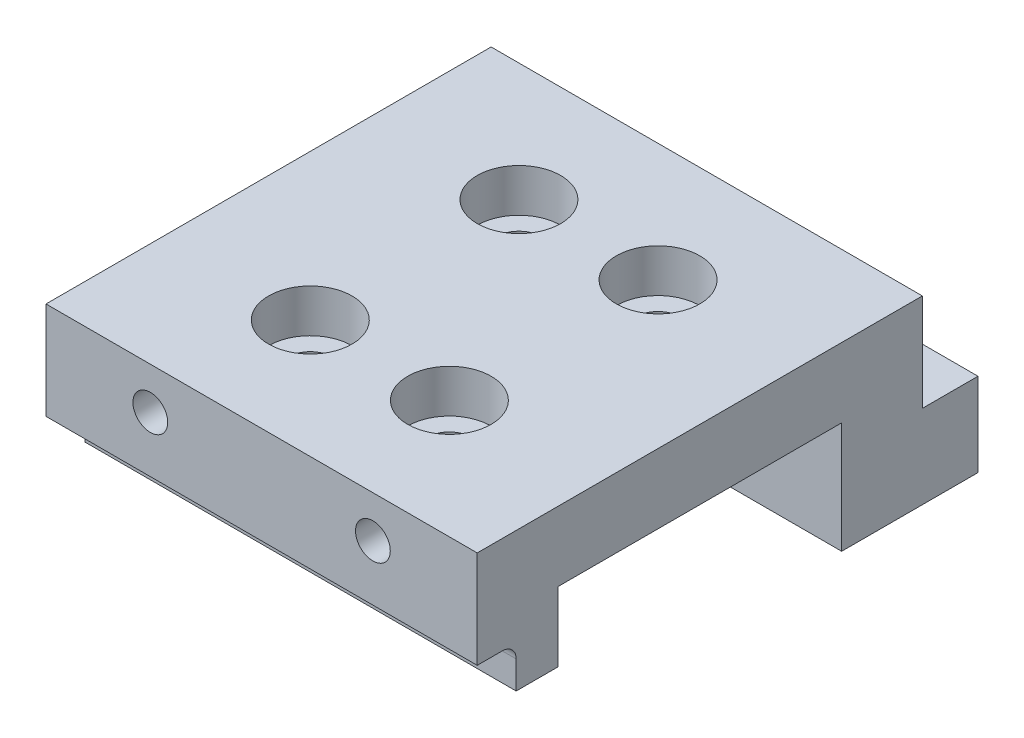
ISO-10303-21;
HEADER;
FILE_DESCRIPTION(('STEP AP214'),'2;1');
FILE_NAME('part.step','',(''),(''),'','','');
FILE_SCHEMA(('AUTOMOTIVE_DESIGN { 1 0 10303 214 1 1 1 1 }'));
ENDSEC;
DATA;
#1=APPLICATION_CONTEXT('core data for automotive mechanical design processes');
#2=APPLICATION_PROTOCOL_DEFINITION('international standard','automotive_design',2000,#1);
#3=PRODUCT_CONTEXT('',#1,'mechanical');
#4=PRODUCT('Part','Part','',(#3));
#5=PRODUCT_RELATED_PRODUCT_CATEGORY('part','',(#4));
#6=PRODUCT_DEFINITION_FORMATION('','',#4);
#7=PRODUCT_DEFINITION_CONTEXT('part definition',#1,'design');
#8=PRODUCT_DEFINITION('design','',#6,#7);
#9=PRODUCT_DEFINITION_SHAPE('','',#8);
#10=(LENGTH_UNIT() NAMED_UNIT(*) SI_UNIT(.MILLI.,.METRE.));
#11=(NAMED_UNIT(*) PLANE_ANGLE_UNIT() SI_UNIT($,.RADIAN.));
#12=(NAMED_UNIT(*) SI_UNIT($,.STERADIAN.) SOLID_ANGLE_UNIT());
#13=UNCERTAINTY_MEASURE_WITH_UNIT(LENGTH_MEASURE(1.E-05),#10,'distance_accuracy_value','');
#14=(GEOMETRIC_REPRESENTATION_CONTEXT(3) GLOBAL_UNCERTAINTY_ASSIGNED_CONTEXT((#13)) GLOBAL_UNIT_ASSIGNED_CONTEXT((#10,
#11,#12)) REPRESENTATION_CONTEXT('',''));
#15=CARTESIAN_POINT('',(0.,0.,0.));
#16=DIRECTION('',(0.,0.,1.));
#17=DIRECTION('',(1.,0.,0.));
#18=AXIS2_PLACEMENT_3D('',#15,#16,#17);
#19=CARTESIAN_POINT('',(0.,5.,0.));
#20=DIRECTION('',(0.,-1.,0.));
#21=DIRECTION('',(0.,0.,-1.));
#22=AXIS2_PLACEMENT_3D('',#19,#20,#21);
#23=PLANE('',#22);
#24=CARTESIAN_POINT('',(10.5,5.,-27.5));
#25=DIRECTION('',(0.,1.,0.));
#26=DIRECTION('',(0.,0.,1.));
#27=AXIS2_PLACEMENT_3D('',#24,#25,#26);
#28=CIRCLE('',#27,3.);
#29=CARTESIAN_POINT('',(10.5,5.,-24.5));
#30=VERTEX_POINT('',#29);
#31=EDGE_CURVE('E240',#30,#30,#28,.T.);
#32=ORIENTED_EDGE('',*,*,#31,.F.);
#33=EDGE_LOOP('',(#32));
#34=FACE_BOUND('',#33,.T.);
#35=CARTESIAN_POINT('',(10.5,5.,-12.5));
#36=DIRECTION('',(0.,1.,0.));
#37=DIRECTION('',(0.,0.,1.));
#38=AXIS2_PLACEMENT_3D('',#35,#36,#37);
#39=CIRCLE('',#38,3.);
#40=CARTESIAN_POINT('',(10.5,5.,-9.5));
#41=VERTEX_POINT('',#40);
#42=EDGE_CURVE('E252',#41,#41,#39,.T.);
#43=ORIENTED_EDGE('',*,*,#42,.F.);
#44=EDGE_LOOP('',(#43));
#45=FACE_BOUND('',#44,.T.);
#46=CARTESIAN_POINT('',(20.5,5.,-12.5));
#47=DIRECTION('',(0.,1.,0.));
#48=DIRECTION('',(0.,0.,1.));
#49=AXIS2_PLACEMENT_3D('',#46,#47,#48);
#50=CIRCLE('',#49,3.);
#51=CARTESIAN_POINT('',(20.5,5.,-9.5));
#52=VERTEX_POINT('',#51);
#53=EDGE_CURVE('E264',#52,#52,#50,.T.);
#54=ORIENTED_EDGE('',*,*,#53,.F.);
#55=EDGE_LOOP('',(#54));
#56=FACE_BOUND('',#55,.T.);
#57=CARTESIAN_POINT('',(20.5,5.,-27.5));
#58=DIRECTION('',(0.,1.,0.));
#59=DIRECTION('',(0.,0.,1.));
#60=AXIS2_PLACEMENT_3D('',#57,#58,#59);
#61=CIRCLE('',#60,3.);
#62=CARTESIAN_POINT('',(20.5,5.,-24.5));
#63=VERTEX_POINT('',#62);
#64=EDGE_CURVE('E276',#63,#63,#61,.T.);
#65=ORIENTED_EDGE('',*,*,#64,.F.);
#66=EDGE_LOOP('',(#65));
#67=FACE_BOUND('',#66,.T.);
#68=DIRECTION('',(-1.,0.,0.));
#69=VECTOR('',#68,1.);
#70=CARTESIAN_POINT('',(31.,5.,-36.));
#71=LINE('',#70,#69);
#72=CARTESIAN_POINT('',(31.,5.,-36.));
#73=VERTEX_POINT('',#72);
#74=CARTESIAN_POINT('',(0.,5.,-36.));
#75=VERTEX_POINT('',#74);
#76=EDGE_CURVE('E157',#73,#75,#71,.T.);
#77=ORIENTED_EDGE('',*,*,#76,.T.);
#78=DIRECTION('',(0.,0.,1.));
#79=VECTOR('',#78,1.);
#80=CARTESIAN_POINT('',(0.,5.,0.));
#81=LINE('',#80,#79);
#82=CARTESIAN_POINT('',(0.,5.,-4.));
#83=VERTEX_POINT('',#82);
#84=EDGE_CURVE('E184',#75,#83,#81,.T.);
#85=ORIENTED_EDGE('',*,*,#84,.T.);
#86=DIRECTION('',(-1.,0.,0.));
#87=VECTOR('',#86,1.);
#88=CARTESIAN_POINT('',(31.,5.,-4.));
#89=LINE('',#88,#87);
#90=CARTESIAN_POINT('',(31.,5.,-4.));
#91=VERTEX_POINT('',#90);
#92=EDGE_CURVE('E181',#91,#83,#89,.T.);
#93=ORIENTED_EDGE('',*,*,#92,.F.);
#94=DIRECTION('',(0.,0.,-1.));
#95=VECTOR('',#94,1.);
#96=CARTESIAN_POINT('',(31.,5.,0.));
#97=LINE('',#96,#95);
#98=EDGE_CURVE('E175',#91,#73,#97,.T.);
#99=ORIENTED_EDGE('',*,*,#98,.T.);
#100=EDGE_LOOP('',(#77,#85,#93,#99));
#101=FACE_BOUND('',#100,.T.);
#102=ADVANCED_FACE('F49',(#34,#45,#56,#67,#101),#23,.F.);
#103=CARTESIAN_POINT('',(0.,5.,0.));
#104=DIRECTION('',(1.,0.,0.));
#105=DIRECTION('',(0.,0.,-1.));
#106=AXIS2_PLACEMENT_3D('',#103,#104,#105);
#107=PLANE('',#106);
#108=DIRECTION('',(0.,0.,-1.));
#109=VECTOR('',#108,1.);
#110=CARTESIAN_POINT('',(0.,-2.,-36.));
#111=LINE('',#110,#109);
#112=CARTESIAN_POINT('',(0.,-2.,-36.));
#113=VERTEX_POINT('',#112);
#114=CARTESIAN_POINT('',(0.,-2.,-40.));
#115=VERTEX_POINT('',#114);
#116=EDGE_CURVE('E856',#113,#115,#111,.T.);
#117=ORIENTED_EDGE('',*,*,#116,.T.);
#118=DIRECTION('',(0.,-1.,0.));
#119=VECTOR('',#118,1.);
#120=CARTESIAN_POINT('',(0.,5.,-40.));
#121=LINE('',#120,#119);
#122=CARTESIAN_POINT('',(0.,-8.,-40.));
#123=VERTEX_POINT('',#122);
#124=EDGE_CURVE('E183',#115,#123,#121,.T.);
#125=ORIENTED_EDGE('',*,*,#124,.T.);
#126=DIRECTION('',(0.,0.,1.));
#127=VECTOR('',#126,1.);
#128=CARTESIAN_POINT('',(0.,-8.,-40.));
#129=LINE('',#128,#127);
#130=CARTESIAN_POINT('',(0.,-8.,-30.2));
#131=VERTEX_POINT('',#130);
#132=EDGE_CURVE('E353',#123,#131,#129,.T.);
#133=ORIENTED_EDGE('',*,*,#132,.T.);
#134=DIRECTION('',(0.,1.,0.));
#135=VECTOR('',#134,1.);
#136=CARTESIAN_POINT('',(0.,-8.,-30.2));
#137=LINE('',#136,#135);
#138=CARTESIAN_POINT('',(0.,0.,-30.2));
#139=VERTEX_POINT('',#138);
#140=EDGE_CURVE('E369',#131,#139,#137,.T.);
#141=ORIENTED_EDGE('',*,*,#140,.T.);
#142=DIRECTION('',(0.,0.,1.));
#143=VECTOR('',#142,1.);
#144=CARTESIAN_POINT('',(0.,0.,0.));
#145=LINE('',#144,#143);
#146=CARTESIAN_POINT('',(0.,0.,-9.8));
#147=VERTEX_POINT('',#146);
#148=EDGE_CURVE('E195',#139,#147,#145,.T.);
#149=ORIENTED_EDGE('',*,*,#148,.T.);
#150=DIRECTION('',(0.,1.,0.));
#151=VECTOR('',#150,1.);
#152=CARTESIAN_POINT('',(0.,-41.1448230047949,-9.8));
#153=LINE('',#152,#151);
#154=CARTESIAN_POINT('',(0.,-5.,-9.8));
#155=VERTEX_POINT('',#154);
#156=EDGE_CURVE('E313',#155,#147,#153,.T.);
#157=ORIENTED_EDGE('',*,*,#156,.F.);
#158=DIRECTION('',(0.,0.,1.));
#159=VECTOR('',#158,1.);
#160=CARTESIAN_POINT('',(0.,-5.,-6.8));
#161=LINE('',#160,#159);
#162=CARTESIAN_POINT('',(0.,-5.,-6.8));
#163=VERTEX_POINT('',#162);
#164=EDGE_CURVE('E308',#155,#163,#161,.T.);
#165=ORIENTED_EDGE('',*,*,#164,.T.);
#166=DIRECTION('',(0.,1.,0.));
#167=VECTOR('',#166,1.);
#168=CARTESIAN_POINT('',(0.,-41.1448230047949,-6.8));
#169=LINE('',#168,#167);
#170=CARTESIAN_POINT('',(0.,-3.,-6.8));
#171=VERTEX_POINT('',#170);
#172=EDGE_CURVE('E312',#163,#171,#169,.T.);
#173=ORIENTED_EDGE('',*,*,#172,.T.);
#174=CARTESIAN_POINT('',(0.,-3.,-5.8));
#175=DIRECTION('',(1.,0.,0.));
#176=DIRECTION('',(0.,0.,-1.));
#177=AXIS2_PLACEMENT_3D('',#174,#175,#176);
#178=CIRCLE('',#177,1.);
#179=CARTESIAN_POINT('',(0.,-2.,-5.8));
#180=VERTEX_POINT('',#179);
#181=EDGE_CURVE('E12',#171,#180,#178,.T.);
#182=ORIENTED_EDGE('',*,*,#181,.T.);
#183=DIRECTION('',(0.,0.,-1.));
#184=VECTOR('',#183,1.);
#185=CARTESIAN_POINT('',(0.,-2.,0.));
#186=LINE('',#185,#184);
#187=CARTESIAN_POINT('',(0.,-2.,-4.));
#188=VERTEX_POINT('',#187);
#189=EDGE_CURVE('E296',#188,#180,#186,.T.);
#190=ORIENTED_EDGE('',*,*,#189,.F.);
#191=DIRECTION('',(0.,-1.,0.));
#192=VECTOR('',#191,1.);
#193=CARTESIAN_POINT('',(0.,5.,-4.));
#194=LINE('',#193,#192);
#195=EDGE_CURVE('E75',#83,#188,#194,.T.);
#196=ORIENTED_EDGE('',*,*,#195,.F.);
#197=ORIENTED_EDGE('',*,*,#84,.F.);
#198=DIRECTION('',(0.,-1.,0.));
#199=VECTOR('',#198,1.);
#200=CARTESIAN_POINT('',(0.,5.,-36.));
#201=LINE('',#200,#199);
#202=EDGE_CURVE('E164',#75,#113,#201,.T.);
#203=ORIENTED_EDGE('',*,*,#202,.T.);
#204=EDGE_LOOP('',(#117,#125,#133,#141,#149,#157,#165,#173,#182,#190,#196,#197,#203));
#205=FACE_BOUND('',#204,.T.);
#206=ADVANCED_FACE('F416',(#205),#107,.F.);
#207=CARTESIAN_POINT('',(31.,5.,0.));
#208=DIRECTION('',(-1.,0.,0.));
#209=DIRECTION('',(0.,0.,1.));
#210=AXIS2_PLACEMENT_3D('',#207,#208,#209);
#211=PLANE('',#210);
#212=DIRECTION('',(0.,0.,-1.));
#213=VECTOR('',#212,1.);
#214=CARTESIAN_POINT('',(31.,-2.,-36.));
#215=LINE('',#214,#213);
#216=CARTESIAN_POINT('',(31.,-2.,-36.));
#217=VERTEX_POINT('',#216);
#218=CARTESIAN_POINT('',(31.,-2.,-40.));
#219=VERTEX_POINT('',#218);
#220=EDGE_CURVE('E67',#217,#219,#215,.T.);
#221=ORIENTED_EDGE('',*,*,#220,.F.);
#222=DIRECTION('',(0.,1.,0.));
#223=VECTOR('',#222,1.);
#224=CARTESIAN_POINT('',(31.,-2.,-36.));
#225=LINE('',#224,#223);
#226=EDGE_CURVE('E162',#217,#73,#225,.T.);
#227=ORIENTED_EDGE('',*,*,#226,.T.);
#228=ORIENTED_EDGE('',*,*,#98,.F.);
#229=DIRECTION('',(0.,1.,0.));
#230=VECTOR('',#229,1.);
#231=CARTESIAN_POINT('',(31.,-2.,-4.));
#232=LINE('',#231,#230);
#233=CARTESIAN_POINT('',(31.,-2.,-4.));
#234=VERTEX_POINT('',#233);
#235=EDGE_CURVE('E217',#234,#91,#232,.T.);
#236=ORIENTED_EDGE('',*,*,#235,.F.);
#237=DIRECTION('',(0.,0.,1.));
#238=VECTOR('',#237,1.);
#239=CARTESIAN_POINT('',(31.,-2.,-6.8));
#240=LINE('',#239,#238);
#241=CARTESIAN_POINT('',(31.,-2.,-5.8));
#242=VERTEX_POINT('',#241);
#243=EDGE_CURVE('E299',#242,#234,#240,.T.);
#244=ORIENTED_EDGE('',*,*,#243,.F.);
#245=CARTESIAN_POINT('',(31.,-3.,-5.8));
#246=DIRECTION('',(-1.,0.,0.));
#247=DIRECTION('',(0.,0.,1.));
#248=AXIS2_PLACEMENT_3D('',#245,#246,#247);
#249=CIRCLE('',#248,1.);
#250=CARTESIAN_POINT('',(31.,-3.,-6.8));
#251=VERTEX_POINT('',#250);
#252=EDGE_CURVE('E59',#242,#251,#249,.T.);
#253=ORIENTED_EDGE('',*,*,#252,.T.);
#254=DIRECTION('',(0.,1.,0.));
#255=VECTOR('',#254,1.);
#256=CARTESIAN_POINT('',(31.,-41.1448230047949,-6.8));
#257=LINE('',#256,#255);
#258=CARTESIAN_POINT('',(31.,-5.,-6.8));
#259=VERTEX_POINT('',#258);
#260=EDGE_CURVE('E307',#259,#251,#257,.T.);
#261=ORIENTED_EDGE('',*,*,#260,.F.);
#262=DIRECTION('',(0.,0.,-1.));
#263=VECTOR('',#262,1.);
#264=CARTESIAN_POINT('',(31.,-5.,-6.8));
#265=LINE('',#264,#263);
#266=CARTESIAN_POINT('',(31.,-5.,-9.8));
#267=VERTEX_POINT('',#266);
#268=EDGE_CURVE('E319',#259,#267,#265,.T.);
#269=ORIENTED_EDGE('',*,*,#268,.T.);
#270=DIRECTION('',(0.,1.,0.));
#271=VECTOR('',#270,1.);
#272=CARTESIAN_POINT('',(31.,-41.1448230047949,-9.8));
#273=LINE('',#272,#271);
#274=CARTESIAN_POINT('',(31.,0.,-9.8));
#275=VERTEX_POINT('',#274);
#276=EDGE_CURVE('E318',#267,#275,#273,.T.);
#277=ORIENTED_EDGE('',*,*,#276,.T.);
#278=DIRECTION('',(0.,0.,-1.));
#279=VECTOR('',#278,1.);
#280=CARTESIAN_POINT('',(31.,0.,0.));
#281=LINE('',#280,#279);
#282=CARTESIAN_POINT('',(31.,0.,-30.2));
#283=VERTEX_POINT('',#282);
#284=EDGE_CURVE('E191',#275,#283,#281,.T.);
#285=ORIENTED_EDGE('',*,*,#284,.T.);
#286=DIRECTION('',(0.,1.,0.));
#287=VECTOR('',#286,1.);
#288=CARTESIAN_POINT('',(31.,-8.,-30.2));
#289=LINE('',#288,#287);
#290=CARTESIAN_POINT('',(31.,-8.,-30.2));
#291=VERTEX_POINT('',#290);
#292=EDGE_CURVE('E373',#291,#283,#289,.T.);
#293=ORIENTED_EDGE('',*,*,#292,.F.);
#294=DIRECTION('',(0.,0.,-1.));
#295=VECTOR('',#294,1.);
#296=CARTESIAN_POINT('',(31.,-8.,-40.));
#297=LINE('',#296,#295);
#298=CARTESIAN_POINT('',(31.,-8.,-40.));
#299=VERTEX_POINT('',#298);
#300=EDGE_CURVE('E361',#291,#299,#297,.T.);
#301=ORIENTED_EDGE('',*,*,#300,.T.);
#302=DIRECTION('',(0.,-1.,0.));
#303=VECTOR('',#302,1.);
#304=CARTESIAN_POINT('',(31.,5.,-40.));
#305=LINE('',#304,#303);
#306=EDGE_CURVE('E189',#219,#299,#305,.T.);
#307=ORIENTED_EDGE('',*,*,#306,.F.);
#308=EDGE_LOOP('',(#221,#227,#228,#236,#244,#253,#261,#269,#277,#285,#293,#301,#307));
#309=FACE_BOUND('',#308,.T.);
#310=ADVANCED_FACE('F173',(#309),#211,.F.);
#311=CARTESIAN_POINT('',(0.,5.,-40.));
#312=DIRECTION('',(0.,0.,1.));
#313=DIRECTION('',(1.,0.,0.));
#314=AXIS2_PLACEMENT_3D('',#311,#312,#313);
#315=PLANE('',#314);
#316=DIRECTION('',(1.,0.,0.));
#317=VECTOR('',#316,1.);
#318=CARTESIAN_POINT('',(0.,-2.,-40.));
#319=LINE('',#318,#317);
#320=EDGE_CURVE('E169',#115,#219,#319,.T.);
#321=ORIENTED_EDGE('',*,*,#320,.T.);
#322=ORIENTED_EDGE('',*,*,#306,.T.);
#323=DIRECTION('',(-1.,0.,0.));
#324=VECTOR('',#323,1.);
#325=CARTESIAN_POINT('',(0.,-8.,-40.));
#326=LINE('',#325,#324);
#327=EDGE_CURVE('E365',#299,#123,#326,.T.);
#328=ORIENTED_EDGE('',*,*,#327,.T.);
#329=ORIENTED_EDGE('',*,*,#124,.F.);
#330=EDGE_LOOP('',(#321,#322,#328,#329));
#331=FACE_BOUND('',#330,.T.);
#332=ADVANCED_FACE('F426',(#331),#315,.F.);
#333=CARTESIAN_POINT('',(0.,-2.,0.));
#334=DIRECTION('',(0.,-1.,0.));
#335=DIRECTION('',(0.,0.,-1.));
#336=AXIS2_PLACEMENT_3D('',#333,#334,#335);
#337=PLANE('',#336);
#338=ORIENTED_EDGE('',*,*,#243,.T.);
#339=DIRECTION('',(1.,0.,0.));
#340=VECTOR('',#339,1.);
#341=CARTESIAN_POINT('',(0.,-2.,-4.));
#342=LINE('',#341,#340);
#343=EDGE_CURVE('E226',#188,#234,#342,.T.);
#344=ORIENTED_EDGE('',*,*,#343,.F.);
#345=ORIENTED_EDGE('',*,*,#189,.T.);
#346=DIRECTION('',(1.,0.,0.));
#347=VECTOR('',#346,1.);
#348=CARTESIAN_POINT('',(31.,-2.,-5.8));
#349=LINE('',#348,#347);
#350=EDGE_CURVE('E205',#180,#242,#349,.T.);
#351=ORIENTED_EDGE('',*,*,#350,.T.);
#352=EDGE_LOOP('',(#338,#344,#345,#351));
#353=FACE_BOUND('',#352,.T.);
#354=ADVANCED_FACE('F411',(#353),#337,.T.);
#355=CARTESIAN_POINT('',(0.,0.,0.));
#356=DIRECTION('',(0.,-1.,0.));
#357=DIRECTION('',(0.,0.,-1.));
#358=AXIS2_PLACEMENT_3D('',#355,#356,#357);
#359=PLANE('',#358);
#360=DIRECTION('',(1.,0.,0.));
#361=VECTOR('',#360,1.);
#362=CARTESIAN_POINT('',(0.,0.,-9.8));
#363=LINE('',#362,#361);
#364=EDGE_CURVE('E334',#147,#275,#363,.T.);
#365=ORIENTED_EDGE('',*,*,#364,.F.);
#366=ORIENTED_EDGE('',*,*,#148,.F.);
#367=DIRECTION('',(1.,0.,0.));
#368=VECTOR('',#367,1.);
#369=CARTESIAN_POINT('',(0.,0.,-30.2));
#370=LINE('',#369,#368);
#371=EDGE_CURVE('E349',#139,#283,#370,.T.);
#372=ORIENTED_EDGE('',*,*,#371,.T.);
#373=ORIENTED_EDGE('',*,*,#284,.F.);
#374=EDGE_LOOP('',(#365,#366,#372,#373));
#375=FACE_BOUND('',#374,.T.);
#376=CARTESIAN_POINT('',(10.5,0.,-27.5));
#377=DIRECTION('',(0.,1.,0.));
#378=DIRECTION('',(0.,0.,1.));
#379=AXIS2_PLACEMENT_3D('',#376,#377,#378);
#380=CIRCLE('',#379,1.6);
#381=CARTESIAN_POINT('',(10.5,0.,-25.9));
#382=VERTEX_POINT('',#381);
#383=EDGE_CURVE('E383',#382,#382,#380,.T.);
#384=ORIENTED_EDGE('',*,*,#383,.T.);
#385=EDGE_LOOP('',(#384));
#386=FACE_BOUND('',#385,.T.);
#387=CARTESIAN_POINT('',(20.5,0.,-27.5));
#388=DIRECTION('',(0.,1.,0.));
#389=DIRECTION('',(0.,0.,1.));
#390=AXIS2_PLACEMENT_3D('',#387,#388,#389);
#391=CIRCLE('',#390,1.6);
#392=CARTESIAN_POINT('',(20.5,0.,-25.9));
#393=VERTEX_POINT('',#392);
#394=EDGE_CURVE('E199',#393,#393,#391,.T.);
#395=ORIENTED_EDGE('',*,*,#394,.T.);
#396=EDGE_LOOP('',(#395));
#397=FACE_BOUND('',#396,.T.);
#398=CARTESIAN_POINT('',(10.5,0.,-12.5));
#399=DIRECTION('',(0.,1.,0.));
#400=DIRECTION('',(0.,0.,-1.));
#401=AXIS2_PLACEMENT_3D('',#398,#399,#400);
#402=CIRCLE('',#401,1.6);
#403=CARTESIAN_POINT('',(10.5,0.,-14.1));
#404=VERTEX_POINT('',#403);
#405=EDGE_CURVE('E387',#404,#404,#402,.T.);
#406=ORIENTED_EDGE('',*,*,#405,.T.);
#407=EDGE_LOOP('',(#406));
#408=FACE_BOUND('',#407,.T.);
#409=CARTESIAN_POINT('',(20.5,0.,-12.5));
#410=DIRECTION('',(0.,1.,0.));
#411=DIRECTION('',(0.,0.,-1.));
#412=AXIS2_PLACEMENT_3D('',#409,#410,#411);
#413=CIRCLE('',#412,1.6);
#414=CARTESIAN_POINT('',(20.5,0.,-14.1));
#415=VERTEX_POINT('',#414);
#416=EDGE_CURVE('E377',#415,#415,#413,.T.);
#417=ORIENTED_EDGE('',*,*,#416,.T.);
#418=EDGE_LOOP('',(#417));
#419=FACE_BOUND('',#418,.T.);
#420=ADVANCED_FACE('F395',(#375,#386,#397,#408,#419),#359,.T.);
#421=CARTESIAN_POINT('',(20.5,5.,-27.5));
#422=DIRECTION('',(0.,-1.,0.));
#423=DIRECTION('',(0.,0.,-1.));
#424=AXIS2_PLACEMENT_3D('',#421,#422,#423);
#425=CYLINDRICAL_SURFACE('',#424,1.6);
#426=CARTESIAN_POINT('',(20.5,1.9,-27.5));
#427=DIRECTION('',(0.,1.,0.));
#428=DIRECTION('',(0.,0.,1.));
#429=AXIS2_PLACEMENT_3D('',#426,#427,#428);
#430=CIRCLE('',#429,1.6);
#431=CARTESIAN_POINT('',(20.5,1.9,-25.9));
#432=VERTEX_POINT('',#431);
#433=EDGE_CURVE('E284',#432,#432,#430,.T.);
#434=ORIENTED_EDGE('',*,*,#433,.T.);
#435=EDGE_LOOP('',(#434));
#436=FACE_BOUND('',#435,.T.);
#437=ORIENTED_EDGE('',*,*,#394,.F.);
#438=EDGE_LOOP('',(#437));
#439=FACE_BOUND('',#438,.T.);
#440=ADVANCED_FACE('F398',(#436,#439),#425,.F.);
#441=CARTESIAN_POINT('',(10.5,5.,-12.5));
#442=DIRECTION('',(0.,-1.,0.));
#443=DIRECTION('',(0.,0.,-1.));
#444=AXIS2_PLACEMENT_3D('',#441,#442,#443);
#445=CYLINDRICAL_SURFACE('',#444,1.6);
#446=CARTESIAN_POINT('',(10.5,1.9,-12.5));
#447=DIRECTION('',(0.,1.,0.));
#448=DIRECTION('',(0.,0.,1.));
#449=AXIS2_PLACEMENT_3D('',#446,#447,#448);
#450=CIRCLE('',#449,1.6);
#451=CARTESIAN_POINT('',(10.5,1.9,-10.9));
#452=VERTEX_POINT('',#451);
#453=EDGE_CURVE('E260',#452,#452,#450,.T.);
#454=ORIENTED_EDGE('',*,*,#453,.T.);
#455=EDGE_LOOP('',(#454));
#456=FACE_BOUND('',#455,.T.);
#457=ORIENTED_EDGE('',*,*,#405,.F.);
#458=EDGE_LOOP('',(#457));
#459=FACE_BOUND('',#458,.T.);
#460=ADVANCED_FACE('F400',(#456,#459),#445,.F.);
#461=CARTESIAN_POINT('',(10.5,5.,-27.5));
#462=DIRECTION('',(0.,-1.,0.));
#463=DIRECTION('',(0.,0.,-1.));
#464=AXIS2_PLACEMENT_3D('',#461,#462,#463);
#465=CYLINDRICAL_SURFACE('',#464,1.6);
#466=CARTESIAN_POINT('',(10.5,1.9,-27.5));
#467=DIRECTION('',(0.,1.,0.));
#468=DIRECTION('',(0.,0.,1.));
#469=AXIS2_PLACEMENT_3D('',#466,#467,#468);
#470=CIRCLE('',#469,1.6);
#471=CARTESIAN_POINT('',(10.5,1.9,-25.9));
#472=VERTEX_POINT('',#471);
#473=EDGE_CURVE('E248',#472,#472,#470,.T.);
#474=ORIENTED_EDGE('',*,*,#473,.T.);
#475=EDGE_LOOP('',(#474));
#476=FACE_BOUND('',#475,.T.);
#477=ORIENTED_EDGE('',*,*,#383,.F.);
#478=EDGE_LOOP('',(#477));
#479=FACE_BOUND('',#478,.T.);
#480=ADVANCED_FACE('F407',(#476,#479),#465,.F.);
#481=CARTESIAN_POINT('',(20.5,5.,-12.5));
#482=DIRECTION('',(0.,-1.,0.));
#483=DIRECTION('',(0.,0.,-1.));
#484=AXIS2_PLACEMENT_3D('',#481,#482,#483);
#485=CYLINDRICAL_SURFACE('',#484,1.6);
#486=CARTESIAN_POINT('',(20.5,1.9,-12.5));
#487=DIRECTION('',(0.,1.,0.));
#488=DIRECTION('',(0.,0.,1.));
#489=AXIS2_PLACEMENT_3D('',#486,#487,#488);
#490=CIRCLE('',#489,1.6);
#491=CARTESIAN_POINT('',(20.5,1.9,-10.9));
#492=VERTEX_POINT('',#491);
#493=EDGE_CURVE('E272',#492,#492,#490,.T.);
#494=ORIENTED_EDGE('',*,*,#493,.T.);
#495=EDGE_LOOP('',(#494));
#496=FACE_BOUND('',#495,.T.);
#497=ORIENTED_EDGE('',*,*,#416,.F.);
#498=EDGE_LOOP('',(#497));
#499=FACE_BOUND('',#498,.T.);
#500=ADVANCED_FACE('F716',(#496,#499),#485,.F.);
#501=CARTESIAN_POINT('',(0.,-8.,-30.2));
#502=DIRECTION('',(0.,0.,1.));
#503=DIRECTION('',(1.,0.,0.));
#504=AXIS2_PLACEMENT_3D('',#501,#502,#503);
#505=PLANE('',#504);
#506=ORIENTED_EDGE('',*,*,#371,.F.);
#507=ORIENTED_EDGE('',*,*,#140,.F.);
#508=DIRECTION('',(1.,0.,0.));
#509=VECTOR('',#508,1.);
#510=CARTESIAN_POINT('',(0.,-8.,-30.2));
#511=LINE('',#510,#509);
#512=EDGE_CURVE('E357',#131,#291,#511,.T.);
#513=ORIENTED_EDGE('',*,*,#512,.T.);
#514=ORIENTED_EDGE('',*,*,#292,.T.);
#515=EDGE_LOOP('',(#506,#507,#513,#514));
#516=FACE_BOUND('',#515,.T.);
#517=ADVANCED_FACE('F707',(#516),#505,.T.);
#518=CARTESIAN_POINT('',(0.,-8.,0.));
#519=DIRECTION('',(0.,1.,0.));
#520=DIRECTION('',(0.,0.,1.));
#521=AXIS2_PLACEMENT_3D('',#518,#519,#520);
#522=PLANE('',#521);
#523=CARTESIAN_POINT('',(15.5,-8.,-35.1));
#524=DIRECTION('',(0.,-1.,0.));
#525=DIRECTION('',(0.,0.,-1.));
#526=AXIS2_PLACEMENT_3D('',#523,#524,#525);
#527=CIRCLE('',#526,3.);
#528=CARTESIAN_POINT('',(15.5,-8.,-38.1));
#529=VERTEX_POINT('',#528);
#530=EDGE_CURVE('E204',#529,#529,#527,.T.);
#531=ORIENTED_EDGE('',*,*,#530,.F.);
#532=EDGE_LOOP('',(#531));
#533=FACE_BOUND('',#532,.T.);
#534=ORIENTED_EDGE('',*,*,#132,.F.);
#535=ORIENTED_EDGE('',*,*,#327,.F.);
#536=ORIENTED_EDGE('',*,*,#300,.F.);
#537=ORIENTED_EDGE('',*,*,#512,.F.);
#538=EDGE_LOOP('',(#534,#535,#536,#537));
#539=FACE_BOUND('',#538,.T.);
#540=ADVANCED_FACE('F698',(#533,#539),#522,.F.);
#541=CARTESIAN_POINT('',(15.5,-9.,-35.1));
#542=DIRECTION('',(0.,-1.,0.));
#543=DIRECTION('',(0.,0.,-1.));
#544=AXIS2_PLACEMENT_3D('',#541,#542,#543);
#545=PLANE('',#544);
#546=CARTESIAN_POINT('',(15.5,-9.,-35.1));
#547=DIRECTION('',(0.,-1.,0.));
#548=DIRECTION('',(0.,0.,-1.));
#549=AXIS2_PLACEMENT_3D('',#546,#547,#548);
#550=CIRCLE('',#549,1.24999999999999);
#551=CARTESIAN_POINT('',(15.5,-9.,-36.35));
#552=VERTEX_POINT('',#551);
#553=EDGE_CURVE('E337',#552,#552,#550,.T.);
#554=ORIENTED_EDGE('',*,*,#553,.F.);
#555=EDGE_LOOP('',(#554));
#556=FACE_BOUND('',#555,.T.);
#557=CARTESIAN_POINT('',(15.5,-9.,-35.1));
#558=DIRECTION('',(0.,-1.,0.));
#559=DIRECTION('',(0.,0.,-1.));
#560=AXIS2_PLACEMENT_3D('',#557,#558,#559);
#561=CIRCLE('',#560,3.);
#562=CARTESIAN_POINT('',(15.5,-9.,-38.1));
#563=VERTEX_POINT('',#562);
#564=EDGE_CURVE('E345',#563,#563,#561,.T.);
#565=ORIENTED_EDGE('',*,*,#564,.T.);
#566=EDGE_LOOP('',(#565));
#567=FACE_BOUND('',#566,.T.);
#568=ADVANCED_FACE('F689',(#556,#567),#545,.T.);
#569=CARTESIAN_POINT('',(15.5,-9.,-35.1));
#570=DIRECTION('',(0.,1.,0.));
#571=DIRECTION('',(0.,0.,1.));
#572=AXIS2_PLACEMENT_3D('',#569,#570,#571);
#573=CYLINDRICAL_SURFACE('',#572,3.);
#574=ORIENTED_EDGE('',*,*,#564,.F.);
#575=EDGE_LOOP('',(#574));
#576=FACE_BOUND('',#575,.T.);
#577=ORIENTED_EDGE('',*,*,#530,.T.);
#578=EDGE_LOOP('',(#577));
#579=FACE_BOUND('',#578,.T.);
#580=ADVANCED_FACE('F680',(#576,#579),#573,.T.);
#581=CARTESIAN_POINT('',(15.5,-2.5,-35.1));
#582=DIRECTION('',(0.,-1.,0.));
#583=DIRECTION('',(0.,0.,-1.));
#584=AXIS2_PLACEMENT_3D('',#581,#582,#583);
#585=CONICAL_SURFACE('',#584,1.25,1.02974425867665);
#586=CARTESIAN_POINT('',(15.5,-1.74892422621555,-35.1));
#587=VERTEX_POINT('',#586);
#588=VERTEX_LOOP('',#587);
#589=FACE_BOUND('',#588,.T.);
#590=CARTESIAN_POINT('',(15.5,-2.5,-35.1));
#591=DIRECTION('',(0.,-1.,0.));
#592=DIRECTION('',(0.,0.,-1.));
#593=AXIS2_PLACEMENT_3D('',#590,#591,#592);
#594=CIRCLE('',#593,1.25);
#595=CARTESIAN_POINT('',(15.5,-2.5,-36.35));
#596=VERTEX_POINT('',#595);
#597=EDGE_CURVE('E341',#596,#596,#594,.T.);
#598=ORIENTED_EDGE('',*,*,#597,.T.);
#599=EDGE_LOOP('',(#598));
#600=FACE_BOUND('',#599,.T.);
#601=ADVANCED_FACE('F670',(#589,#600),#585,.F.);
#602=CARTESIAN_POINT('',(15.5,-9.,-35.1));
#603=DIRECTION('',(0.,-1.,0.));
#604=DIRECTION('',(0.,0.,-1.));
#605=AXIS2_PLACEMENT_3D('',#602,#603,#604);
#606=CYLINDRICAL_SURFACE('',#605,1.24999999999999);
#607=ORIENTED_EDGE('',*,*,#597,.F.);
#608=EDGE_LOOP('',(#607));
#609=FACE_BOUND('',#608,.T.);
#610=ORIENTED_EDGE('',*,*,#553,.T.);
#611=EDGE_LOOP('',(#610));
#612=FACE_BOUND('',#611,.T.);
#613=ADVANCED_FACE('F661',(#609,#612),#606,.F.);
#614=CARTESIAN_POINT('',(0.,-5.,0.));
#615=DIRECTION('',(0.,-1.,0.));
#616=DIRECTION('',(0.,0.,-1.));
#617=AXIS2_PLACEMENT_3D('',#614,#615,#616);
#618=PLANE('',#617);
#619=ORIENTED_EDGE('',*,*,#164,.F.);
#620=DIRECTION('',(-1.,0.,0.));
#621=VECTOR('',#620,1.);
#622=CARTESIAN_POINT('',(0.,-5.,-9.8));
#623=LINE('',#622,#621);
#624=EDGE_CURVE('E314',#267,#155,#623,.T.);
#625=ORIENTED_EDGE('',*,*,#624,.F.);
#626=ORIENTED_EDGE('',*,*,#268,.F.);
#627=DIRECTION('',(1.,0.,0.));
#628=VECTOR('',#627,1.);
#629=CARTESIAN_POINT('',(0.,-5.,-6.8));
#630=LINE('',#629,#628);
#631=EDGE_CURVE('E303',#163,#259,#630,.T.);
#632=ORIENTED_EDGE('',*,*,#631,.F.);
#633=EDGE_LOOP('',(#619,#625,#626,#632));
#634=FACE_BOUND('',#633,.T.);
#635=ADVANCED_FACE('F652',(#634),#618,.T.);
#636=CARTESIAN_POINT('',(0.,-41.1448230047949,-6.8));
#637=DIRECTION('',(0.,0.,1.));
#638=DIRECTION('',(1.,0.,0.));
#639=AXIS2_PLACEMENT_3D('',#636,#637,#638);
#640=PLANE('',#639);
#641=ORIENTED_EDGE('',*,*,#260,.T.);
#642=DIRECTION('',(1.,0.,0.));
#643=VECTOR('',#642,1.);
#644=CARTESIAN_POINT('',(0.,-3.,-6.8));
#645=LINE('',#644,#643);
#646=EDGE_CURVE('E209',#251,#171,#645,.F.);
#647=ORIENTED_EDGE('',*,*,#646,.T.);
#648=ORIENTED_EDGE('',*,*,#172,.F.);
#649=ORIENTED_EDGE('',*,*,#631,.T.);
#650=EDGE_LOOP('',(#641,#647,#648,#649));
#651=FACE_BOUND('',#650,.T.);
#652=ADVANCED_FACE('F643',(#651),#640,.T.);
#653=CARTESIAN_POINT('',(0.,-41.1448230047949,-9.8));
#654=DIRECTION('',(0.,0.,-1.));
#655=DIRECTION('',(-1.,0.,0.));
#656=AXIS2_PLACEMENT_3D('',#653,#654,#655);
#657=PLANE('',#656);
#658=ORIENTED_EDGE('',*,*,#156,.T.);
#659=ORIENTED_EDGE('',*,*,#364,.T.);
#660=ORIENTED_EDGE('',*,*,#276,.F.);
#661=ORIENTED_EDGE('',*,*,#624,.T.);
#662=EDGE_LOOP('',(#658,#659,#660,#661));
#663=FACE_BOUND('',#662,.T.);
#664=ADVANCED_FACE('F610',(#663),#657,.T.);
#665=CARTESIAN_POINT('',(22.1,1.9,-27.5));
#666=DIRECTION('',(0.,-1.,0.));
#667=DIRECTION('',(0.,0.,-1.));
#668=AXIS2_PLACEMENT_3D('',#665,#666,#667);
#669=PLANE('',#668);
#670=ORIENTED_EDGE('',*,*,#433,.F.);
#671=EDGE_LOOP('',(#670));
#672=FACE_BOUND('',#671,.T.);
#673=CARTESIAN_POINT('',(20.5,1.9,-27.5));
#674=DIRECTION('',(0.,1.,0.));
#675=DIRECTION('',(0.,0.,1.));
#676=AXIS2_PLACEMENT_3D('',#673,#674,#675);
#677=CIRCLE('',#676,3.);
#678=CARTESIAN_POINT('',(20.5,1.9,-24.5));
#679=VERTEX_POINT('',#678);
#680=EDGE_CURVE('E280',#679,#679,#677,.T.);
#681=ORIENTED_EDGE('',*,*,#680,.T.);
#682=EDGE_LOOP('',(#681));
#683=FACE_BOUND('',#682,.T.);
#684=ADVANCED_FACE('F601',(#672,#683),#669,.F.);
#685=CARTESIAN_POINT('',(20.5,5.,-27.5));
#686=DIRECTION('',(0.,1.,0.));
#687=DIRECTION('',(0.,0.,1.));
#688=AXIS2_PLACEMENT_3D('',#685,#686,#687);
#689=CYLINDRICAL_SURFACE('',#688,3.);
#690=ORIENTED_EDGE('',*,*,#680,.F.);
#691=EDGE_LOOP('',(#690));
#692=FACE_BOUND('',#691,.T.);
#693=ORIENTED_EDGE('',*,*,#64,.T.);
#694=EDGE_LOOP('',(#693));
#695=FACE_BOUND('',#694,.T.);
#696=ADVANCED_FACE('F592',(#692,#695),#689,.F.);
#697=CARTESIAN_POINT('',(22.1,1.9,-12.5));
#698=DIRECTION('',(0.,-1.,0.));
#699=DIRECTION('',(0.,0.,-1.));
#700=AXIS2_PLACEMENT_3D('',#697,#698,#699);
#701=PLANE('',#700);
#702=ORIENTED_EDGE('',*,*,#493,.F.);
#703=EDGE_LOOP('',(#702));
#704=FACE_BOUND('',#703,.T.);
#705=CARTESIAN_POINT('',(20.5,1.9,-12.5));
#706=DIRECTION('',(0.,1.,0.));
#707=DIRECTION('',(0.,0.,1.));
#708=AXIS2_PLACEMENT_3D('',#705,#706,#707);
#709=CIRCLE('',#708,3.);
#710=CARTESIAN_POINT('',(20.5,1.9,-9.5));
#711=VERTEX_POINT('',#710);
#712=EDGE_CURVE('E268',#711,#711,#709,.T.);
#713=ORIENTED_EDGE('',*,*,#712,.T.);
#714=EDGE_LOOP('',(#713));
#715=FACE_BOUND('',#714,.T.);
#716=ADVANCED_FACE('F583',(#704,#715),#701,.F.);
#717=CARTESIAN_POINT('',(20.5,5.,-12.5));
#718=DIRECTION('',(0.,1.,0.));
#719=DIRECTION('',(0.,0.,1.));
#720=AXIS2_PLACEMENT_3D('',#717,#718,#719);
#721=CYLINDRICAL_SURFACE('',#720,3.);
#722=ORIENTED_EDGE('',*,*,#712,.F.);
#723=EDGE_LOOP('',(#722));
#724=FACE_BOUND('',#723,.T.);
#725=ORIENTED_EDGE('',*,*,#53,.T.);
#726=EDGE_LOOP('',(#725));
#727=FACE_BOUND('',#726,.T.);
#728=ADVANCED_FACE('F574',(#724,#727),#721,.F.);
#729=CARTESIAN_POINT('',(12.1,1.9,-12.5));
#730=DIRECTION('',(0.,-1.,0.));
#731=DIRECTION('',(0.,0.,-1.));
#732=AXIS2_PLACEMENT_3D('',#729,#730,#731);
#733=PLANE('',#732);
#734=ORIENTED_EDGE('',*,*,#453,.F.);
#735=EDGE_LOOP('',(#734));
#736=FACE_BOUND('',#735,.T.);
#737=CARTESIAN_POINT('',(10.5,1.9,-12.5));
#738=DIRECTION('',(0.,1.,0.));
#739=DIRECTION('',(0.,0.,1.));
#740=AXIS2_PLACEMENT_3D('',#737,#738,#739);
#741=CIRCLE('',#740,3.);
#742=CARTESIAN_POINT('',(10.5,1.9,-9.5));
#743=VERTEX_POINT('',#742);
#744=EDGE_CURVE('E256',#743,#743,#741,.T.);
#745=ORIENTED_EDGE('',*,*,#744,.T.);
#746=EDGE_LOOP('',(#745));
#747=FACE_BOUND('',#746,.T.);
#748=ADVANCED_FACE('F565',(#736,#747),#733,.F.);
#749=CARTESIAN_POINT('',(10.5,5.,-12.5));
#750=DIRECTION('',(0.,1.,0.));
#751=DIRECTION('',(0.,0.,1.));
#752=AXIS2_PLACEMENT_3D('',#749,#750,#751);
#753=CYLINDRICAL_SURFACE('',#752,3.);
#754=ORIENTED_EDGE('',*,*,#744,.F.);
#755=EDGE_LOOP('',(#754));
#756=FACE_BOUND('',#755,.T.);
#757=ORIENTED_EDGE('',*,*,#42,.T.);
#758=EDGE_LOOP('',(#757));
#759=FACE_BOUND('',#758,.T.);
#760=ADVANCED_FACE('F556',(#756,#759),#753,.F.);
#761=CARTESIAN_POINT('',(12.1,1.9,-27.5));
#762=DIRECTION('',(0.,-1.,0.));
#763=DIRECTION('',(0.,0.,-1.));
#764=AXIS2_PLACEMENT_3D('',#761,#762,#763);
#765=PLANE('',#764);
#766=ORIENTED_EDGE('',*,*,#473,.F.);
#767=EDGE_LOOP('',(#766));
#768=FACE_BOUND('',#767,.T.);
#769=CARTESIAN_POINT('',(10.5,1.9,-27.5));
#770=DIRECTION('',(0.,1.,0.));
#771=DIRECTION('',(0.,0.,1.));
#772=AXIS2_PLACEMENT_3D('',#769,#770,#771);
#773=CIRCLE('',#772,3.);
#774=CARTESIAN_POINT('',(10.5,1.9,-24.5));
#775=VERTEX_POINT('',#774);
#776=EDGE_CURVE('E244',#775,#775,#773,.T.);
#777=ORIENTED_EDGE('',*,*,#776,.T.);
#778=EDGE_LOOP('',(#777));
#779=FACE_BOUND('',#778,.T.);
#780=ADVANCED_FACE('F547',(#768,#779),#765,.F.);
#781=CARTESIAN_POINT('',(10.5,5.,-27.5));
#782=DIRECTION('',(0.,1.,0.));
#783=DIRECTION('',(0.,0.,1.));
#784=AXIS2_PLACEMENT_3D('',#781,#782,#783);
#785=CYLINDRICAL_SURFACE('',#784,3.);
#786=ORIENTED_EDGE('',*,*,#776,.F.);
#787=EDGE_LOOP('',(#786));
#788=FACE_BOUND('',#787,.T.);
#789=ORIENTED_EDGE('',*,*,#31,.T.);
#790=EDGE_LOOP('',(#789));
#791=FACE_BOUND('',#790,.T.);
#792=ADVANCED_FACE('F530',(#788,#791),#785,.F.);
#793=CARTESIAN_POINT('',(0.,-3.,-5.8));
#794=DIRECTION('',(-1.,0.,0.));
#795=DIRECTION('',(0.,0.,1.));
#796=AXIS2_PLACEMENT_3D('',#793,#794,#795);
#797=CYLINDRICAL_SURFACE('',#796,1.);
#798=ORIENTED_EDGE('',*,*,#181,.F.);
#799=ORIENTED_EDGE('',*,*,#646,.F.);
#800=ORIENTED_EDGE('',*,*,#252,.F.);
#801=ORIENTED_EDGE('',*,*,#350,.F.);
#802=EDGE_LOOP('',(#798,#799,#800,#801));
#803=FACE_BOUND('',#802,.T.);
#804=ADVANCED_FACE('F51',(#803),#797,.F.);
#805=CARTESIAN_POINT('',(0.,0.,-4.));
#806=DIRECTION('',(0.,0.,1.));
#807=DIRECTION('',(1.,0.,0.));
#808=AXIS2_PLACEMENT_3D('',#805,#806,#807);
#809=PLANE('',#808);
#810=ORIENTED_EDGE('',*,*,#92,.T.);
#811=ORIENTED_EDGE('',*,*,#195,.T.);
#812=ORIENTED_EDGE('',*,*,#343,.T.);
#813=ORIENTED_EDGE('',*,*,#235,.T.);
#814=EDGE_LOOP('',(#810,#811,#812,#813));
#815=FACE_BOUND('',#814,.T.);
#816=CARTESIAN_POINT('',(7.5,2.,-4.));
#817=DIRECTION('',(0.,0.,1.));
#818=DIRECTION('',(1.,0.,0.));
#819=AXIS2_PLACEMENT_3D('',#816,#817,#818);
#820=CIRCLE('',#819,1.24999999999999);
#821=CARTESIAN_POINT('',(8.74999999999999,2.,-4.));
#822=VERTEX_POINT('',#821);
#823=EDGE_CURVE('E213',#822,#822,#820,.F.);
#824=ORIENTED_EDGE('',*,*,#823,.T.);
#825=EDGE_LOOP('',(#824));
#826=FACE_BOUND('',#825,.T.);
#827=CARTESIAN_POINT('',(23.5,2.,-4.));
#828=DIRECTION('',(0.,0.,1.));
#829=DIRECTION('',(1.,0.,0.));
#830=AXIS2_PLACEMENT_3D('',#827,#828,#829);
#831=CIRCLE('',#830,1.24999999999999);
#832=CARTESIAN_POINT('',(24.75,2.,-4.));
#833=VERTEX_POINT('',#832);
#834=EDGE_CURVE('E216',#833,#833,#831,.F.);
#835=ORIENTED_EDGE('',*,*,#834,.T.);
#836=EDGE_LOOP('',(#835));
#837=FACE_BOUND('',#836,.T.);
#838=ADVANCED_FACE('F487',(#815,#826,#837),#809,.T.);
#839=CARTESIAN_POINT('',(23.5,2.,-9.));
#840=DIRECTION('',(0.,0.,-1.));
#841=DIRECTION('',(-1.,0.,0.));
#842=AXIS2_PLACEMENT_3D('',#839,#840,#841);
#843=PLANE('',#842);
#844=CARTESIAN_POINT('',(23.5,2.,-9.));
#845=DIRECTION('',(0.,0.,-1.));
#846=DIRECTION('',(-1.,0.,0.));
#847=AXIS2_PLACEMENT_3D('',#844,#845,#846);
#848=CIRCLE('',#847,1.24999999999999);
#849=CARTESIAN_POINT('',(22.25,2.,-9.));
#850=VERTEX_POINT('',#849);
#851=EDGE_CURVE('E292',#850,#850,#848,.F.);
#852=ORIENTED_EDGE('',*,*,#851,.T.);
#853=EDGE_LOOP('',(#852));
#854=FACE_BOUND('',#853,.T.);
#855=ADVANCED_FACE('F491',(#854),#843,.F.);
#856=CARTESIAN_POINT('',(23.5,2.,0.));
#857=DIRECTION('',(0.,0.,1.));
#858=DIRECTION('',(1.,0.,0.));
#859=AXIS2_PLACEMENT_3D('',#856,#857,#858);
#860=CYLINDRICAL_SURFACE('',#859,1.24999999999999);
#861=ORIENTED_EDGE('',*,*,#851,.F.);
#862=EDGE_LOOP('',(#861));
#863=FACE_BOUND('',#862,.T.);
#864=ORIENTED_EDGE('',*,*,#834,.F.);
#865=EDGE_LOOP('',(#864));
#866=FACE_BOUND('',#865,.T.);
#867=ADVANCED_FACE('F506',(#863,#866),#860,.F.);
#868=CARTESIAN_POINT('',(7.5,2.,-9.));
#869=DIRECTION('',(0.,0.,1.));
#870=DIRECTION('',(1.,0.,0.));
#871=AXIS2_PLACEMENT_3D('',#868,#869,#870);
#872=CONICAL_SURFACE('',#871,1.25,1.02974425867665);
#873=CARTESIAN_POINT('',(7.5,2.,-9.75107577378445));
#874=VERTEX_POINT('',#873);
#875=VERTEX_LOOP('',#874);
#876=FACE_BOUND('',#875,.T.);
#877=CARTESIAN_POINT('',(7.5,2.,-9.));
#878=DIRECTION('',(0.,0.,1.));
#879=DIRECTION('',(1.,0.,0.));
#880=AXIS2_PLACEMENT_3D('',#877,#878,#879);
#881=CIRCLE('',#880,1.25);
#882=CARTESIAN_POINT('',(8.75,2.,-9.));
#883=VERTEX_POINT('',#882);
#884=EDGE_CURVE('E288',#883,#883,#881,.T.);
#885=ORIENTED_EDGE('',*,*,#884,.T.);
#886=EDGE_LOOP('',(#885));
#887=FACE_BOUND('',#886,.T.);
#888=ADVANCED_FACE('F511',(#876,#887),#872,.F.);
#889=CARTESIAN_POINT('',(7.5,2.,0.));
#890=DIRECTION('',(0.,0.,1.));
#891=DIRECTION('',(1.,0.,0.));
#892=AXIS2_PLACEMENT_3D('',#889,#890,#891);
#893=CYLINDRICAL_SURFACE('',#892,1.24999999999999);
#894=ORIENTED_EDGE('',*,*,#884,.F.);
#895=EDGE_LOOP('',(#894));
#896=FACE_BOUND('',#895,.T.);
#897=ORIENTED_EDGE('',*,*,#823,.F.);
#898=EDGE_LOOP('',(#897));
#899=FACE_BOUND('',#898,.T.);
#900=ADVANCED_FACE('F450',(#896,#899),#893,.F.);
#901=CARTESIAN_POINT('',(0.,0.,-36.));
#902=DIRECTION('',(0.,0.,-1.));
#903=DIRECTION('',(1.,0.,0.));
#904=AXIS2_PLACEMENT_3D('',#901,#902,#903);
#905=PLANE('',#904);
#906=ORIENTED_EDGE('',*,*,#76,.F.);
#907=ORIENTED_EDGE('',*,*,#226,.F.);
#908=DIRECTION('',(1.,0.,0.));
#909=VECTOR('',#908,1.);
#910=CARTESIAN_POINT('',(0.,-2.,-36.));
#911=LINE('',#910,#909);
#912=EDGE_CURVE('E178',#113,#217,#911,.T.);
#913=ORIENTED_EDGE('',*,*,#912,.F.);
#914=ORIENTED_EDGE('',*,*,#202,.F.);
#915=EDGE_LOOP('',(#906,#907,#913,#914));
#916=FACE_BOUND('',#915,.T.);
#917=CARTESIAN_POINT('',(7.5,2.,-36.));
#918=DIRECTION('',(0.,0.,-1.));
#919=DIRECTION('',(-1.,0.,0.));
#920=AXIS2_PLACEMENT_3D('',#917,#918,#919);
#921=CIRCLE('',#920,1.24999999999999);
#922=CARTESIAN_POINT('',(6.25000000000001,2.,-36.));
#923=VERTEX_POINT('',#922);
#924=EDGE_CURVE('E53',#923,#923,#921,.F.);
#925=ORIENTED_EDGE('',*,*,#924,.T.);
#926=EDGE_LOOP('',(#925));
#927=FACE_BOUND('',#926,.T.);
#928=CARTESIAN_POINT('',(23.5,2.,-36.));
#929=DIRECTION('',(0.,0.,-1.));
#930=DIRECTION('',(-1.,0.,0.));
#931=AXIS2_PLACEMENT_3D('',#928,#929,#930);
#932=CIRCLE('',#931,1.24999999999999);
#933=CARTESIAN_POINT('',(22.25,2.,-36.));
#934=VERTEX_POINT('',#933);
#935=EDGE_CURVE('E846',#934,#934,#932,.F.);
#936=ORIENTED_EDGE('',*,*,#935,.T.);
#937=EDGE_LOOP('',(#936));
#938=FACE_BOUND('',#937,.T.);
#939=ADVANCED_FACE('F159',(#916,#927,#938),#905,.T.);
#940=CARTESIAN_POINT('',(0.,-2.,-36.));
#941=DIRECTION('',(0.,1.,0.));
#942=DIRECTION('',(0.,0.,1.));
#943=AXIS2_PLACEMENT_3D('',#940,#941,#942);
#944=PLANE('',#943);
#945=ORIENTED_EDGE('',*,*,#320,.F.);
#946=ORIENTED_EDGE('',*,*,#116,.F.);
#947=ORIENTED_EDGE('',*,*,#912,.T.);
#948=ORIENTED_EDGE('',*,*,#220,.T.);
#949=EDGE_LOOP('',(#945,#946,#947,#948));
#950=FACE_BOUND('',#949,.T.);
#951=ADVANCED_FACE('F449',(#950),#944,.T.);
#952=CARTESIAN_POINT('',(23.5,2.,-31.));
#953=DIRECTION('',(0.,0.,-1.));
#954=DIRECTION('',(-1.,0.,0.));
#955=AXIS2_PLACEMENT_3D('',#952,#953,#954);
#956=CONICAL_SURFACE('',#955,1.25,1.02974425867665);
#957=CARTESIAN_POINT('',(23.5,2.,-30.2489242262155));
#958=VERTEX_POINT('',#957);
#959=VERTEX_LOOP('',#958);
#960=FACE_BOUND('',#959,.T.);
#961=CARTESIAN_POINT('',(23.5,2.,-31.));
#962=DIRECTION('',(0.,0.,-1.));
#963=DIRECTION('',(-1.,0.,0.));
#964=AXIS2_PLACEMENT_3D('',#961,#962,#963);
#965=CIRCLE('',#964,1.25);
#966=CARTESIAN_POINT('',(22.25,2.,-31.));
#967=VERTEX_POINT('',#966);
#968=EDGE_CURVE('E236',#967,#967,#965,.T.);
#969=ORIENTED_EDGE('',*,*,#968,.T.);
#970=EDGE_LOOP('',(#969));
#971=FACE_BOUND('',#970,.T.);
#972=ADVANCED_FACE('F458',(#960,#971),#956,.F.);
#973=CARTESIAN_POINT('',(23.5,2.,-40.));
#974=DIRECTION('',(0.,0.,-1.));
#975=DIRECTION('',(-1.,0.,0.));
#976=AXIS2_PLACEMENT_3D('',#973,#974,#975);
#977=CYLINDRICAL_SURFACE('',#976,1.24999999999999);
#978=ORIENTED_EDGE('',*,*,#968,.F.);
#979=EDGE_LOOP('',(#978));
#980=FACE_BOUND('',#979,.T.);
#981=ORIENTED_EDGE('',*,*,#935,.F.);
#982=EDGE_LOOP('',(#981));
#983=FACE_BOUND('',#982,.T.);
#984=ADVANCED_FACE('F463',(#980,#983),#977,.F.);
#985=CARTESIAN_POINT('',(7.5,2.,-31.));
#986=DIRECTION('',(0.,0.,-1.));
#987=DIRECTION('',(1.,0.,0.));
#988=AXIS2_PLACEMENT_3D('',#985,#986,#987);
#989=PLANE('',#988);
#990=CARTESIAN_POINT('',(7.5,2.,-31.));
#991=DIRECTION('',(0.,0.,-1.));
#992=DIRECTION('',(-1.,0.,0.));
#993=AXIS2_PLACEMENT_3D('',#990,#991,#992);
#994=CIRCLE('',#993,1.24999999999999);
#995=CARTESIAN_POINT('',(6.25000000000001,2.,-31.));
#996=VERTEX_POINT('',#995);
#997=EDGE_CURVE('E224',#996,#996,#994,.F.);
#998=ORIENTED_EDGE('',*,*,#997,.F.);
#999=EDGE_LOOP('',(#998));
#1000=FACE_BOUND('',#999,.T.);
#1001=ADVANCED_FACE('F467',(#1000),#989,.T.);
#1002=CARTESIAN_POINT('',(7.5,2.,-40.));
#1003=DIRECTION('',(0.,0.,-1.));
#1004=DIRECTION('',(-1.,0.,0.));
#1005=AXIS2_PLACEMENT_3D('',#1002,#1003,#1004);
#1006=CYLINDRICAL_SURFACE('',#1005,1.24999999999999);
#1007=ORIENTED_EDGE('',*,*,#997,.T.);
#1008=EDGE_LOOP('',(#1007));
#1009=FACE_BOUND('',#1008,.T.);
#1010=ORIENTED_EDGE('',*,*,#924,.F.);
#1011=EDGE_LOOP('',(#1010));
#1012=FACE_BOUND('',#1011,.T.);
#1013=ADVANCED_FACE('F476',(#1009,#1012),#1006,.F.);
#1014=CLOSED_SHELL('',(#102,#206,#310,#332,#354,#420,#440,#460,#480,#500,#517,#540,#568,#580,
#601,#613,#635,#652,#664,#684,#696,#716,#728,#748,#760,#780,#792,#804,#838,#855,#867,#888,#900,
#939,#951,#972,#984,#1001,#1013));
#1015=MANIFOLD_SOLID_BREP('B2',#1014);
#1016=ADVANCED_BREP_SHAPE_REPRESENTATION('',(#18,#1015),#14);
#1017=SHAPE_DEFINITION_REPRESENTATION(#9,#1016);
ENDSEC;
END-ISO-10303-21;
